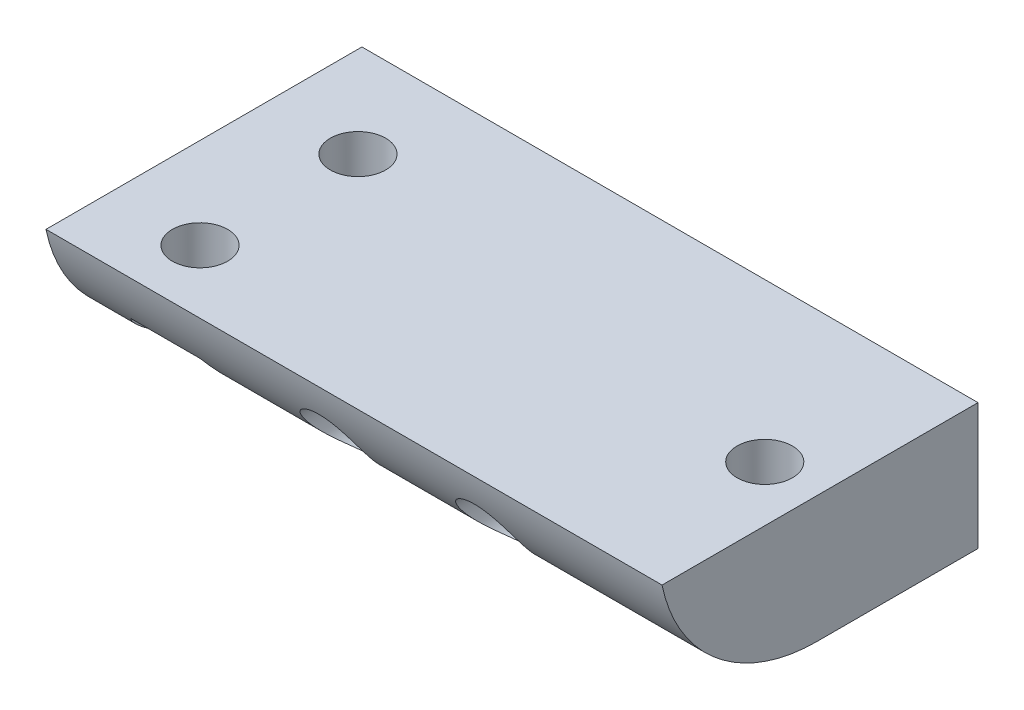
ISO-10303-21;
HEADER;
FILE_DESCRIPTION(('STEP AP214'),'2;1');
FILE_NAME('part.step','',(''),(''),'','','');
FILE_SCHEMA(('AUTOMOTIVE_DESIGN { 1 0 10303 214 1 1 1 1 }'));
ENDSEC;
DATA;
#1=APPLICATION_CONTEXT('core data for automotive mechanical design processes');
#2=APPLICATION_PROTOCOL_DEFINITION('international standard','automotive_design',2000,#1);
#3=PRODUCT_CONTEXT('',#1,'mechanical');
#4=PRODUCT('Part','Part','',(#3));
#5=PRODUCT_RELATED_PRODUCT_CATEGORY('part','',(#4));
#6=PRODUCT_DEFINITION_FORMATION('','',#4);
#7=PRODUCT_DEFINITION_CONTEXT('part definition',#1,'design');
#8=PRODUCT_DEFINITION('design','',#6,#7);
#9=PRODUCT_DEFINITION_SHAPE('','',#8);
#10=(LENGTH_UNIT() NAMED_UNIT(*) SI_UNIT(.MILLI.,.METRE.));
#11=(NAMED_UNIT(*) PLANE_ANGLE_UNIT() SI_UNIT($,.RADIAN.));
#12=(NAMED_UNIT(*) SI_UNIT($,.STERADIAN.) SOLID_ANGLE_UNIT());
#13=UNCERTAINTY_MEASURE_WITH_UNIT(LENGTH_MEASURE(1.E-05),#10,'distance_accuracy_value','');
#14=(GEOMETRIC_REPRESENTATION_CONTEXT(3) GLOBAL_UNCERTAINTY_ASSIGNED_CONTEXT((#13)) GLOBAL_UNIT_ASSIGNED_CONTEXT((#10,
#11,#12)) REPRESENTATION_CONTEXT('',''));
#15=CARTESIAN_POINT('',(0.,0.,0.));
#16=DIRECTION('',(0.,0.,1.));
#17=DIRECTION('',(1.,0.,0.));
#18=AXIS2_PLACEMENT_3D('',#15,#16,#17);
#19=CARTESIAN_POINT('',(-0.885282092778937,3.79686795239579,56.));
#20=DIRECTION('',(0.,1.,0.));
#21=DIRECTION('',(0.,0.,-1.));
#22=AXIS2_PLACEMENT_3D('',#19,#20,#21);
#23=CYLINDRICAL_SURFACE('',#22,1.75);
#24=CARTESIAN_POINT('',(-0.885282092778937,11.7978679523958,56.));
#25=DIRECTION('',(0.,-1.,0.));
#26=DIRECTION('',(0.,0.,-1.));
#27=AXIS2_PLACEMENT_3D('',#24,#25,#26);
#28=CIRCLE('',#27,1.75);
#29=CARTESIAN_POINT('',(-0.885282092778937,11.7978679523958,54.25));
#30=VERTEX_POINT('',#29);
#31=EDGE_CURVE('E216',#30,#30,#28,.T.);
#32=ORIENTED_EDGE('',*,*,#31,.F.);
#33=EDGE_LOOP('',(#32));
#34=FACE_BOUND('',#33,.T.);
#35=CARTESIAN_POINT('',(-0.885282092778937,7.79786795239579,56.));
#36=DIRECTION('',(0.,1.,0.));
#37=DIRECTION('',(0.,0.,1.));
#38=AXIS2_PLACEMENT_3D('',#35,#36,#37);
#39=CIRCLE('',#38,1.75);
#40=CARTESIAN_POINT('',(-0.885282092778937,7.79786795239579,57.75));
#41=VERTEX_POINT('',#40);
#42=EDGE_CURVE('E210',#41,#41,#39,.F.);
#43=ORIENTED_EDGE('',*,*,#42,.T.);
#44=EDGE_LOOP('',(#43));
#45=FACE_BOUND('',#44,.T.);
#46=ADVANCED_FACE('F39',(#34,#45),#23,.F.);
#47=CARTESIAN_POINT('',(-0.885282092778937,3.79686795239579,46.));
#48=DIRECTION('',(0.,1.,0.));
#49=DIRECTION('',(0.,0.,-1.));
#50=AXIS2_PLACEMENT_3D('',#47,#48,#49);
#51=CYLINDRICAL_SURFACE('',#50,1.75);
#52=CARTESIAN_POINT('',(-0.885282092778937,11.7978679523958,46.));
#53=DIRECTION('',(0.,-1.,0.));
#54=DIRECTION('',(0.,0.,-1.));
#55=AXIS2_PLACEMENT_3D('',#52,#53,#54);
#56=CIRCLE('',#55,1.75);
#57=CARTESIAN_POINT('',(-0.885282092778937,11.7978679523958,44.25));
#58=VERTEX_POINT('',#57);
#59=EDGE_CURVE('E231',#58,#58,#56,.T.);
#60=ORIENTED_EDGE('',*,*,#59,.F.);
#61=EDGE_LOOP('',(#60));
#62=FACE_BOUND('',#61,.T.);
#63=CARTESIAN_POINT('',(-0.885282092778937,7.79786795239579,46.));
#64=DIRECTION('',(0.,1.,0.));
#65=DIRECTION('',(0.,0.,1.));
#66=AXIS2_PLACEMENT_3D('',#63,#64,#65);
#67=CIRCLE('',#66,1.75);
#68=CARTESIAN_POINT('',(-0.885282092778937,7.79786795239579,47.75));
#69=VERTEX_POINT('',#68);
#70=EDGE_CURVE('E44',#69,#69,#67,.F.);
#71=ORIENTED_EDGE('',*,*,#70,.T.);
#72=EDGE_LOOP('',(#71));
#73=FACE_BOUND('',#72,.T.);
#74=ADVANCED_FACE('F175',(#62,#73),#51,.F.);
#75=CARTESIAN_POINT('',(28.8647179072211,3.79686795239579,50.));
#76=DIRECTION('',(0.,1.,0.));
#77=DIRECTION('',(0.,0.,-1.));
#78=AXIS2_PLACEMENT_3D('',#75,#76,#77);
#79=CYLINDRICAL_SURFACE('',#78,1.75);
#80=CARTESIAN_POINT('',(28.8647179072211,11.7978679523958,50.));
#81=DIRECTION('',(0.,-1.,0.));
#82=DIRECTION('',(0.,0.,-1.));
#83=AXIS2_PLACEMENT_3D('',#80,#81,#82);
#84=CIRCLE('',#83,1.75);
#85=CARTESIAN_POINT('',(28.8647179072211,11.7978679523958,48.25));
#86=VERTEX_POINT('',#85);
#87=EDGE_CURVE('E227',#86,#86,#84,.T.);
#88=ORIENTED_EDGE('',*,*,#87,.F.);
#89=EDGE_LOOP('',(#88));
#90=FACE_BOUND('',#89,.T.);
#91=CARTESIAN_POINT('',(28.8647179072211,7.79786795239579,50.));
#92=DIRECTION('',(0.,1.,0.));
#93=DIRECTION('',(0.,0.,1.));
#94=AXIS2_PLACEMENT_3D('',#91,#92,#93);
#95=CIRCLE('',#94,1.75);
#96=CARTESIAN_POINT('',(28.8647179072211,7.79786795239579,51.75));
#97=VERTEX_POINT('',#96);
#98=EDGE_CURVE('E207',#97,#97,#95,.F.);
#99=ORIENTED_EDGE('',*,*,#98,.T.);
#100=EDGE_LOOP('',(#99));
#101=FACE_BOUND('',#100,.T.);
#102=ADVANCED_FACE('F159',(#90,#101),#79,.F.);
#103=CARTESIAN_POINT('',(0.,0.,40.));
#104=DIRECTION('',(0.,0.,-1.));
#105=DIRECTION('',(1.,0.,0.));
#106=AXIS2_PLACEMENT_3D('',#103,#104,#105);
#107=PLANE('',#106);
#108=CARTESIAN_POINT('',(9.88971790722106,7.54786795239579,40.));
#109=DIRECTION('',(0.,0.,1.));
#110=DIRECTION('',(1.,0.,0.));
#111=AXIS2_PLACEMENT_3D('',#108,#109,#110);
#112=CIRCLE('',#111,2.);
#113=CARTESIAN_POINT('',(11.8897179072211,7.54786795239579,40.));
#114=VERTEX_POINT('',#113);
#115=EDGE_CURVE('E139',#114,#114,#112,.T.);
#116=ORIENTED_EDGE('',*,*,#115,.T.);
#117=EDGE_LOOP('',(#116));
#118=FACE_BOUND('',#117,.T.);
#119=DIRECTION('',(0.,-1.,0.));
#120=VECTOR('',#119,1.);
#121=CARTESIAN_POINT('',(-6.63528209277894,11.7978679523958,40.));
#122=LINE('',#121,#120);
#123=CARTESIAN_POINT('',(-6.63528209277894,11.7978679523958,40.));
#124=VERTEX_POINT('',#123);
#125=CARTESIAN_POINT('',(-6.63528209277894,3.79786795239579,40.));
#126=VERTEX_POINT('',#125);
#127=EDGE_CURVE('E245',#124,#126,#122,.T.);
#128=ORIENTED_EDGE('',*,*,#127,.F.);
#129=DIRECTION('',(-1.,0.,0.));
#130=VECTOR('',#129,1.);
#131=CARTESIAN_POINT('',(-6.63528209277894,11.7978679523958,40.));
#132=LINE('',#131,#130);
#133=CARTESIAN_POINT('',(32.3647179072211,11.7978679523958,40.));
#134=VERTEX_POINT('',#133);
#135=EDGE_CURVE('E256',#134,#124,#132,.T.);
#136=ORIENTED_EDGE('',*,*,#135,.F.);
#137=DIRECTION('',(0.,1.,0.));
#138=VECTOR('',#137,1.);
#139=CARTESIAN_POINT('',(32.3647179072211,11.7978679523958,40.));
#140=LINE('',#139,#138);
#141=CARTESIAN_POINT('',(32.3647179072211,3.79786795239579,40.));
#142=VERTEX_POINT('',#141);
#143=EDGE_CURVE('E252',#142,#134,#140,.T.);
#144=ORIENTED_EDGE('',*,*,#143,.F.);
#145=DIRECTION('',(1.,0.,0.));
#146=VECTOR('',#145,1.);
#147=CARTESIAN_POINT('',(-6.63528209277894,3.79786795239579,40.));
#148=LINE('',#147,#146);
#149=EDGE_CURVE('E249',#126,#142,#148,.T.);
#150=ORIENTED_EDGE('',*,*,#149,.F.);
#151=EDGE_LOOP('',(#128,#136,#144,#150));
#152=FACE_BOUND('',#151,.T.);
#153=CARTESIAN_POINT('',(19.7397179072211,7.54786795239579,40.));
#154=DIRECTION('',(0.,0.,1.));
#155=DIRECTION('',(1.,0.,0.));
#156=AXIS2_PLACEMENT_3D('',#153,#154,#155);
#157=CIRCLE('',#156,2.);
#158=CARTESIAN_POINT('',(21.7397179072211,7.54786795239579,40.));
#159=VERTEX_POINT('',#158);
#160=EDGE_CURVE('E140',#159,#159,#157,.T.);
#161=ORIENTED_EDGE('',*,*,#160,.T.);
#162=EDGE_LOOP('',(#161));
#163=FACE_BOUND('',#162,.T.);
#164=ADVANCED_FACE('F155',(#118,#152,#163),#107,.T.);
#165=CARTESIAN_POINT('',(-6.63528209277894,11.7978679523958,40.));
#166=DIRECTION('',(1.,0.,0.));
#167=DIRECTION('',(0.,1.,0.));
#168=AXIS2_PLACEMENT_3D('',#165,#166,#167);
#169=PLANE('',#168);
#170=DIRECTION('',(0.,0.,1.));
#171=VECTOR('',#170,1.);
#172=CARTESIAN_POINT('',(-6.63528209277894,11.7978679523958,40.));
#173=LINE('',#172,#171);
#174=CARTESIAN_POINT('',(-6.63528209277894,11.7978679523958,60.));
#175=VERTEX_POINT('',#174);
#176=EDGE_CURVE('E260',#124,#175,#173,.T.);
#177=ORIENTED_EDGE('',*,*,#176,.F.);
#178=ORIENTED_EDGE('',*,*,#127,.T.);
#179=DIRECTION('',(0.,0.,1.));
#180=VECTOR('',#179,1.);
#181=CARTESIAN_POINT('',(-6.63528209277894,3.79786795239579,40.));
#182=LINE('',#181,#180);
#183=CARTESIAN_POINT('',(-6.63528209277894,3.79786795239579,50.2020410288673));
#184=VERTEX_POINT('',#183);
#185=EDGE_CURVE('E117',#126,#184,#182,.T.);
#186=ORIENTED_EDGE('',*,*,#185,.T.);
#187=CARTESIAN_POINT('',(-6.63528209277894,13.7978679523958,50.2020410288673));
#188=DIRECTION('',(-1.,0.,0.));
#189=DIRECTION('',(0.,1.,0.));
#190=AXIS2_PLACEMENT_3D('',#187,#188,#189);
#191=CIRCLE('',#190,10.);
#192=EDGE_CURVE('E104',#175,#184,#191,.F.);
#193=ORIENTED_EDGE('',*,*,#192,.F.);
#194=EDGE_LOOP('',(#177,#178,#186,#193));
#195=FACE_BOUND('',#194,.T.);
#196=ADVANCED_FACE('F158',(#195),#169,.F.);
#197=CARTESIAN_POINT('',(-6.63528209277894,3.79786795239579,40.));
#198=DIRECTION('',(0.,1.,0.));
#199=DIRECTION('',(0.,0.,-1.));
#200=AXIS2_PLACEMENT_3D('',#197,#198,#199);
#201=PLANE('',#200);
#202=CARTESIAN_POINT('',(-0.885282092778937,3.79786795239579,46.));
#203=DIRECTION('',(0.,1.,0.));
#204=DIRECTION('',(0.,0.,1.));
#205=AXIS2_PLACEMENT_3D('',#202,#203,#204);
#206=CIRCLE('',#205,3.1);
#207=CARTESIAN_POINT('',(-0.885282092778937,3.79786795239579,49.1));
#208=VERTEX_POINT('',#207);
#209=EDGE_CURVE('E223',#208,#208,#206,.T.);
#210=ORIENTED_EDGE('',*,*,#209,.T.);
#211=EDGE_LOOP('',(#210));
#212=FACE_BOUND('',#211,.T.);
#213=DIRECTION('',(1.,0.,0.));
#214=VECTOR('',#213,1.);
#215=CARTESIAN_POINT('',(-6.63528209277894,3.79786795239579,50.2020410288673));
#216=LINE('',#215,#214);
#217=CARTESIAN_POINT('',(25.771308877905,3.79786795239579,50.2020410288673));
#218=VERTEX_POINT('',#217);
#219=EDGE_CURVE('E102',#184,#218,#216,.T.);
#220=ORIENTED_EDGE('',*,*,#219,.F.);
#221=ORIENTED_EDGE('',*,*,#185,.F.);
#222=ORIENTED_EDGE('',*,*,#149,.T.);
#223=DIRECTION('',(0.,0.,1.));
#224=VECTOR('',#223,1.);
#225=CARTESIAN_POINT('',(32.3647179072211,3.79786795239579,40.));
#226=LINE('',#225,#224);
#227=CARTESIAN_POINT('',(32.3647179072211,3.79786795239579,50.2020410288673));
#228=VERTEX_POINT('',#227);
#229=EDGE_CURVE('E115',#142,#228,#226,.T.);
#230=ORIENTED_EDGE('',*,*,#229,.T.);
#231=DIRECTION('',(1.,0.,0.));
#232=VECTOR('',#231,1.);
#233=CARTESIAN_POINT('',(-6.63528209277894,3.79786795239579,50.2020410288673));
#234=LINE('',#233,#232);
#235=CARTESIAN_POINT('',(31.9581269365371,3.79786795239579,50.2020410288673));
#236=VERTEX_POINT('',#235);
#237=EDGE_CURVE('E99',#236,#228,#234,.T.);
#238=ORIENTED_EDGE('',*,*,#237,.F.);
#239=CARTESIAN_POINT('',(28.8647179072211,3.79786795239579,50.));
#240=DIRECTION('',(0.,1.,0.));
#241=DIRECTION('',(0.,0.,1.));
#242=AXIS2_PLACEMENT_3D('',#239,#240,#241);
#243=CIRCLE('',#242,3.1);
#244=EDGE_CURVE('E106',#236,#218,#243,.T.);
#245=ORIENTED_EDGE('',*,*,#244,.T.);
#246=EDGE_LOOP('',(#220,#221,#222,#230,#238,#245));
#247=FACE_BOUND('',#246,.T.);
#248=ADVANCED_FACE('F113',(#212,#247),#201,.F.);
#249=CARTESIAN_POINT('',(32.3647179072211,11.7978679523958,40.));
#250=DIRECTION('',(-1.,0.,0.));
#251=DIRECTION('',(0.,0.,-1.));
#252=AXIS2_PLACEMENT_3D('',#249,#250,#251);
#253=PLANE('',#252);
#254=ORIENTED_EDGE('',*,*,#229,.F.);
#255=ORIENTED_EDGE('',*,*,#143,.T.);
#256=DIRECTION('',(0.,0.,1.));
#257=VECTOR('',#256,1.);
#258=CARTESIAN_POINT('',(32.3647179072211,11.7978679523958,40.));
#259=LINE('',#258,#257);
#260=CARTESIAN_POINT('',(32.3647179072211,11.7978679523958,60.));
#261=VERTEX_POINT('',#260);
#262=EDGE_CURVE('E266',#134,#261,#259,.T.);
#263=ORIENTED_EDGE('',*,*,#262,.T.);
#264=CARTESIAN_POINT('',(32.3647179072211,13.7978679523958,50.2020410288673));
#265=DIRECTION('',(1.,0.,0.));
#266=DIRECTION('',(0.,0.,-1.));
#267=AXIS2_PLACEMENT_3D('',#264,#265,#266);
#268=CIRCLE('',#267,10.);
#269=EDGE_CURVE('E121',#228,#261,#268,.F.);
#270=ORIENTED_EDGE('',*,*,#269,.F.);
#271=EDGE_LOOP('',(#254,#255,#263,#270));
#272=FACE_BOUND('',#271,.T.);
#273=ADVANCED_FACE('F163',(#272),#253,.F.);
#274=CARTESIAN_POINT('',(-6.63528209277894,11.7978679523958,40.));
#275=DIRECTION('',(0.,-1.,0.));
#276=DIRECTION('',(0.,0.,1.));
#277=AXIS2_PLACEMENT_3D('',#274,#275,#276);
#278=PLANE('',#277);
#279=ORIENTED_EDGE('',*,*,#87,.T.);
#280=EDGE_LOOP('',(#279));
#281=FACE_BOUND('',#280,.T.);
#282=ORIENTED_EDGE('',*,*,#59,.T.);
#283=EDGE_LOOP('',(#282));
#284=FACE_BOUND('',#283,.T.);
#285=ORIENTED_EDGE('',*,*,#31,.T.);
#286=EDGE_LOOP('',(#285));
#287=FACE_BOUND('',#286,.T.);
#288=DIRECTION('',(-1.,0.,0.));
#289=VECTOR('',#288,1.);
#290=CARTESIAN_POINT('',(-6.63528209277894,11.7978679523958,60.));
#291=LINE('',#290,#289);
#292=EDGE_CURVE('E244',#261,#175,#291,.T.);
#293=ORIENTED_EDGE('',*,*,#292,.F.);
#294=ORIENTED_EDGE('',*,*,#262,.F.);
#295=ORIENTED_EDGE('',*,*,#135,.T.);
#296=ORIENTED_EDGE('',*,*,#176,.T.);
#297=EDGE_LOOP('',(#293,#294,#295,#296));
#298=FACE_BOUND('',#297,.T.);
#299=ADVANCED_FACE('F151',(#281,#284,#287,#298),#278,.F.);
#300=CARTESIAN_POINT('',(9.88971790722106,7.54786795239579,40.));
#301=DIRECTION('',(0.,0.,1.));
#302=DIRECTION('',(-1.,0.,0.));
#303=AXIS2_PLACEMENT_3D('',#300,#301,#302);
#304=CYLINDRICAL_SURFACE('',#303,2.);
#305=ORIENTED_EDGE('',*,*,#115,.F.);
#306=EDGE_LOOP('',(#305));
#307=FACE_BOUND('',#306,.T.);
#308=CARTESIAN_POINT('',(8.06706713452882,8.37124159832121,58.601548539029));
#309=CARTESIAN_POINT('',(8.03684840403237,8.30434313191308,58.5583261607813));
#310=CARTESIAN_POINT('',(8.01070371922054,8.23664322015131,58.5134495620556));
#311=CARTESIAN_POINT('',(7.96628275027579,8.10061553952446,58.4208077045263));
#312=CARTESIAN_POINT('',(7.94801321392808,8.03228728325485,58.3730400083013));
#313=CARTESIAN_POINT('',(7.90437238311397,7.82711414357992,58.2256533635746));
#314=CARTESIAN_POINT('',(7.89034402169671,7.69048724323069,58.1222115097615));
#315=CARTESIAN_POINT('',(7.88906368612502,7.40811192355309,57.8966698866913));
#316=CARTESIAN_POINT('',(7.90494558743367,7.26302650368383,57.7737720041326));
#317=CARTESIAN_POINT('',(7.96568742907636,6.98343871907239,57.5231597558677));
#318=CARTESIAN_POINT('',(8.0105585403283,6.84894045648772,57.3954435513053));
#319=CARTESIAN_POINT('',(8.09804184445983,6.65626652154989,57.2024697015324));
#320=CARTESIAN_POINT('',(8.13085053201474,6.59316860126641,57.1374783292698));
#321=CARTESIAN_POINT('',(8.20315124999806,6.47057706504911,57.0078285547478));
#322=CARTESIAN_POINT('',(8.24264071200764,6.41108207586274,56.9431700343302));
#323=CARTESIAN_POINT('',(8.32828315761671,6.2960452169771,56.8149126824572));
#324=CARTESIAN_POINT('',(8.37442861469255,6.24049898658284,56.7513127433822));
#325=CARTESIAN_POINT('',(8.47360444702865,6.13367892559521,56.6259791055149));
#326=CARTESIAN_POINT('',(8.5266308510256,6.08240265844842,56.5642443553913));
#327=CARTESIAN_POINT('',(8.64902642423236,5.97680849475583,56.4341438331699));
#328=CARTESIAN_POINT('',(8.71965348019377,5.92330461898732,56.3662857431302));
#329=CARTESIAN_POINT('',(8.87165787449071,5.82398218637763,56.2372496307611));
#330=CARTESIAN_POINT('',(8.95302139950199,5.77815392332546,56.1760632064786));
#331=CARTESIAN_POINT('',(9.10605828855624,5.70635824440362,56.0782823441685));
#332=CARTESIAN_POINT('',(9.1752129500256,5.67827653517361,56.0393371864255));
#333=CARTESIAN_POINT('',(9.32019681286711,5.62915141059759,55.9703910759463));
#334=CARTESIAN_POINT('',(9.39601376439686,5.60809540567515,55.9403741350609));
#335=CARTESIAN_POINT('',(9.53701188650633,5.57818192620844,55.8974169125104));
#336=CARTESIAN_POINT('',(9.60115333173919,5.56770282164011,55.8822296106611));
#337=CARTESIAN_POINT('',(9.73162331195037,5.5530493587498,55.8609402087646));
#338=CARTESIAN_POINT('',(9.79794959120912,5.54886869398012,55.854829021151));
#339=CARTESIAN_POINT('',(9.9310185609371,5.5471855948123,55.8523723660674));
#340=CARTESIAN_POINT('',(9.99776184146238,5.54969760797718,55.8560480255694));
#341=CARTESIAN_POINT('',(10.129495552086,5.56118947051188,55.8727750518683));
#342=CARTESIAN_POINT('',(10.1944844417527,5.5701748236472,55.8858343968409));
#343=CARTESIAN_POINT('',(10.3365924075314,5.59678492783064,55.9241818911909));
#344=CARTESIAN_POINT('',(10.4128133687158,5.61598027784545,55.9516729786255));
#345=CARTESIAN_POINT('',(10.558870638318,5.66156962265168,56.0160073741236));
#346=CARTESIAN_POINT('',(10.6286933269441,5.68797851814815,56.0528700295859));
#347=CARTESIAN_POINT('',(10.796875764961,5.76197518714132,56.1543626775795));
#348=CARTESIAN_POINT('',(10.8908660112933,5.81338723672818,56.2233841046516));
#349=CARTESIAN_POINT('',(11.0649277912908,5.92623990535108,56.3701940537324));
#350=CARTESIAN_POINT('',(11.1449641295273,5.98770514625471,56.4480039515692));
#351=CARTESIAN_POINT('',(11.2742359123618,6.10266136958501,56.5887401851632));
#352=CARTESIAN_POINT('',(11.3262076065718,6.15440143610911,56.6506265374632));
#353=CARTESIAN_POINT('',(11.4233395343652,6.26207361634839,56.776129592004));
#354=CARTESIAN_POINT('',(11.4684965630168,6.31800768410363,56.8397470919043));
#355=CARTESIAN_POINT('',(11.5521820380131,6.43372625882879,56.9679018700757));
#356=CARTESIAN_POINT('',(11.5907070106654,6.49351276120705,57.0324396112983));
#357=CARTESIAN_POINT('',(11.661109769403,6.61663244317661,57.1617716001406));
#358=CARTESIAN_POINT('',(11.6929850519517,6.67996694720942,57.2265659350436));
#359=CARTESIAN_POINT('',(11.7796131969431,6.87757946250146,57.4231543876984));
#360=CARTESIAN_POINT('',(11.8236903165677,7.01714715268273,57.5545590247186));
#361=CARTESIAN_POINT('',(11.8806523094256,7.30715715388089,57.8117790010141));
#362=CARTESIAN_POINT('',(11.8935877802272,7.45758141540277,57.9376030803236));
#363=CARTESIAN_POINT('',(11.8849827321834,7.72885849223791,58.1512305087954));
#364=CARTESIAN_POINT('',(11.8708189939144,7.84836891350585,58.2410280440232));
#365=CARTESIAN_POINT('',(11.8192962610595,8.08795393541835,58.4129182421623));
#366=CARTESIAN_POINT('',(11.7819661239353,8.20802764999484,58.4950203447361));
#367=CARTESIAN_POINT('',(11.6902681564626,8.42512892739424,58.6369529948687));
#368=CARTESIAN_POINT('',(11.6396013579732,8.52275967673197,58.6982424719991));
#369=CARTESIAN_POINT('',(11.5201091781366,8.71160729000116,58.8126228526022));
#370=CARTESIAN_POINT('',(11.451288263743,8.80282572474656,58.8657157678118));
#371=CARTESIAN_POINT('',(11.2954996380895,8.97522672132363,58.9628631882565));
#372=CARTESIAN_POINT('',(11.2084218706267,9.05634343060684,59.0068595070477));
#373=CARTESIAN_POINT('',(11.0182555167431,9.20341028579624,59.0844901899622));
#374=CARTESIAN_POINT('',(10.9151755318249,9.2693685327005,59.1181300920501));
#375=CARTESIAN_POINT('',(10.7089068072316,9.37565936029879,59.17127760703));
#376=CARTESIAN_POINT('',(10.6070846536291,9.41806256008998,59.1919630785863));
#377=CARTESIAN_POINT('',(10.396581196682,9.48572544987975,59.2246158026805));
#378=CARTESIAN_POINT('',(10.2879031337039,9.5109931733865,59.2365871407994));
#379=CARTESIAN_POINT('',(10.0749956447425,9.54196774307373,59.251216811826));
#380=CARTESIAN_POINT('',(9.97098548825754,9.54891728229886,59.2544670817389));
#381=CARTESIAN_POINT('',(9.76319917015645,9.54656265622635,59.2533617852767));
#382=CARTESIAN_POINT('',(9.65942296807273,9.53726155912013,59.2490076546459));
#383=CARTESIAN_POINT('',(9.45712501358356,9.50316489374229,59.2328696412277));
#384=CARTESIAN_POINT('',(9.35854061593182,9.47867044646765,59.2212301098696));
#385=CARTESIAN_POINT('',(9.16722198191219,9.41552612890989,59.1907172664889));
#386=CARTESIAN_POINT('',(9.0744873559411,9.37687720250473,59.171844436808));
#387=CARTESIAN_POINT('',(8.89564975609166,9.28627249757092,59.1266195330204));
#388=CARTESIAN_POINT('',(8.80968911000281,9.23409826550997,59.1001438235197));
#389=CARTESIAN_POINT('',(8.64809221646538,9.11892492256977,59.0401233266356));
#390=CARTESIAN_POINT('',(8.57246120689919,9.05592035621934,59.006574974673));
#391=CARTESIAN_POINT('',(8.42876445055972,8.91758910333795,58.9306978114702));
#392=CARTESIAN_POINT('',(8.36139724817968,8.84175805283822,58.8879709994366));
#393=CARTESIAN_POINT('',(8.24049755832886,8.68363485707528,58.7958156867291));
#394=CARTESIAN_POINT('',(8.18694959305393,8.60135007603825,58.7463947790402));
#395=CARTESIAN_POINT('',(8.11365787760933,8.46908610848271,58.6641516995079));
#396=CARTESIAN_POINT('',(8.08926348362562,8.42038005285062,58.633296364984));
#397=CARTESIAN_POINT('',(8.06706713452882,8.37124159832121,58.601548539029));
#398=B_SPLINE_CURVE_WITH_KNOTS('',3,(#308,#309,#310,#311,#312,#313,#314,#315,#316,#317,#318,
#319,#320,#321,#322,#323,#324,#325,#326,#327,#328,#329,#330,#331,#332,#333,#334,#335,#336,#337,
#338,#339,#340,#341,#342,#343,#344,#345,#346,#347,#348,#349,#350,#351,#352,#353,#354,#355,#356,
#357,#358,#359,#360,#361,#362,#363,#364,#365,#366,#367,#368,#369,#370,#371,#372,#373,#374,#375,
#376,#377,#378,#379,#380,#381,#382,#383,#384,#385,#386,#387,#388,#389,#390,#391,#392,#393,#394,
#395,#396,#397),.UNSPECIFIED.,.T.,.F.,(4,2,2,2,2,2,2,2,2,2,2,2,2,2,2,2,2,2,2,2,2,2,2,2,2,2,2,2,
2,2,2,2,2,2,2,2,2,2,2,2,2,2,2,2,4),(0.,0.255491071982923,0.511200627260811,1.02413565654776,
1.59381515462571,2.163714308285,2.45250019619512,2.74117531183391,3.02952651946682,
3.31771204242053,3.65174783012232,3.98535796970025,4.23713480346648,4.48845801675372,
4.68784643525911,4.8870350788481,5.08665406152812,5.28644296493177,5.53486488228596,
5.78380388611113,6.16402622927968,6.545194139023,6.83271548200721,7.12037162744736,
7.40817798402832,7.69609250182189,8.28338586514439,8.86972437438287,9.31849455623655,
9.76670684190923,10.1429061897785,10.5190130572383,10.8974559531392,11.2756961285114,
11.6105842934499,11.9453153463191,12.2566727940372,12.5679714624558,12.8732893003509,
13.178586782123,13.4891611212393,13.7998923642037,14.1287473566934,14.457232411074,
14.6448964502869),.UNSPECIFIED.);
#399=CARTESIAN_POINT('',(8.06706713452882,8.37124159832121,58.601548539029));
#400=VERTEX_POINT('',#399);
#401=EDGE_CURVE('E131',#400,#400,#398,.T.);
#402=ORIENTED_EDGE('',*,*,#401,.T.);
#403=EDGE_LOOP('',(#402));
#404=FACE_BOUND('',#403,.T.);
#405=ADVANCED_FACE('F146',(#307,#404),#304,.F.);
#406=CARTESIAN_POINT('',(19.7397179072211,7.54786795239579,40.));
#407=DIRECTION('',(0.,0.,1.));
#408=DIRECTION('',(-1.,0.,0.));
#409=AXIS2_PLACEMENT_3D('',#406,#407,#408);
#410=CYLINDRICAL_SURFACE('',#409,2.);
#411=ORIENTED_EDGE('',*,*,#160,.F.);
#412=EDGE_LOOP('',(#411));
#413=FACE_BOUND('',#412,.T.);
#414=CARTESIAN_POINT('',(17.9170671345288,8.37124159832121,58.601548539029));
#415=CARTESIAN_POINT('',(17.8868484040324,8.30434313191308,58.5583261607813));
#416=CARTESIAN_POINT('',(17.8607037192205,8.23664322015132,58.5134495620556));
#417=CARTESIAN_POINT('',(17.8162827502758,8.10061553952446,58.4208077045263));
#418=CARTESIAN_POINT('',(17.7980132139281,8.03228728325485,58.3730400083013));
#419=CARTESIAN_POINT('',(17.754372383114,7.82711414357992,58.2256533635746));
#420=CARTESIAN_POINT('',(17.7403440216967,7.69048724323069,58.1222115097615));
#421=CARTESIAN_POINT('',(17.739063686125,7.40811192355309,57.8966698866913));
#422=CARTESIAN_POINT('',(17.7549455874337,7.26302650368383,57.7737720041326));
#423=CARTESIAN_POINT('',(17.8156874290764,6.98343871907239,57.5231597558677));
#424=CARTESIAN_POINT('',(17.8605585403283,6.84894045648772,57.3954435513053));
#425=CARTESIAN_POINT('',(17.9480418444598,6.65626652154989,57.2024697015324));
#426=CARTESIAN_POINT('',(17.9808505320147,6.59316860126641,57.1374783292698));
#427=CARTESIAN_POINT('',(18.0531512499981,6.47057706504911,57.0078285547478));
#428=CARTESIAN_POINT('',(18.0926407120076,6.41108207586274,56.9431700343302));
#429=CARTESIAN_POINT('',(18.1782831576167,6.2960452169771,56.8149126824572));
#430=CARTESIAN_POINT('',(18.2244286146926,6.24049898658284,56.7513127433822));
#431=CARTESIAN_POINT('',(18.3236044470286,6.13367892559521,56.6259791055149));
#432=CARTESIAN_POINT('',(18.3766308510256,6.08240265844842,56.5642443553913));
#433=CARTESIAN_POINT('',(18.4990264242324,5.97680849475583,56.4341438331699));
#434=CARTESIAN_POINT('',(18.5696534801938,5.92330461898732,56.3662857431302));
#435=CARTESIAN_POINT('',(18.7216578744907,5.82398218637763,56.2372496307611));
#436=CARTESIAN_POINT('',(18.803021399502,5.77815392332546,56.1760632064786));
#437=CARTESIAN_POINT('',(18.9560582885562,5.70635824440362,56.0782823441685));
#438=CARTESIAN_POINT('',(19.0252129500256,5.67827653517361,56.0393371864255));
#439=CARTESIAN_POINT('',(19.1701968128671,5.62915141059759,55.9703910759463));
#440=CARTESIAN_POINT('',(19.2460137643968,5.60809540567515,55.9403741350609));
#441=CARTESIAN_POINT('',(19.3870118865063,5.57818192620844,55.8974169125104));
#442=CARTESIAN_POINT('',(19.4511533317392,5.56770282164011,55.8822296106611));
#443=CARTESIAN_POINT('',(19.5816233119504,5.5530493587498,55.8609402087646));
#444=CARTESIAN_POINT('',(19.6479495912091,5.54886869398012,55.854829021151));
#445=CARTESIAN_POINT('',(19.7810185609371,5.5471855948123,55.8523723660674));
#446=CARTESIAN_POINT('',(19.8477618414624,5.54969760797718,55.8560480255694));
#447=CARTESIAN_POINT('',(19.979495552086,5.56118947051188,55.8727750518683));
#448=CARTESIAN_POINT('',(20.0444844417527,5.5701748236472,55.8858343968409));
#449=CARTESIAN_POINT('',(20.1865924075314,5.59678492783063,55.9241818911909));
#450=CARTESIAN_POINT('',(20.2628133687158,5.61598027784545,55.9516729786255));
#451=CARTESIAN_POINT('',(20.408870638318,5.66156962265168,56.0160073741236));
#452=CARTESIAN_POINT('',(20.4786933269441,5.68797851814815,56.0528700295859));
#453=CARTESIAN_POINT('',(20.6468757649609,5.76197518714132,56.1543626775795));
#454=CARTESIAN_POINT('',(20.7408660112933,5.81338723672817,56.2233841046516));
#455=CARTESIAN_POINT('',(20.9149277912907,5.92623990535108,56.3701940537324));
#456=CARTESIAN_POINT('',(20.9949641295273,5.9877051462547,56.4480039515692));
#457=CARTESIAN_POINT('',(21.1242359123618,6.102661369585,56.5887401851632));
#458=CARTESIAN_POINT('',(21.1762076065718,6.1544014361091,56.6506265374632));
#459=CARTESIAN_POINT('',(21.2733395343652,6.26207361634838,56.776129592004));
#460=CARTESIAN_POINT('',(21.3184965630168,6.31800768410362,56.8397470919043));
#461=CARTESIAN_POINT('',(21.4021820380131,6.43372625882878,56.9679018700757));
#462=CARTESIAN_POINT('',(21.4407070106654,6.49351276120704,57.0324396112983));
#463=CARTESIAN_POINT('',(21.511109769403,6.6166324431766,57.1617716001406));
#464=CARTESIAN_POINT('',(21.5429850519517,6.67996694720942,57.2265659350436));
#465=CARTESIAN_POINT('',(21.6296131969431,6.87757946250145,57.4231543876984));
#466=CARTESIAN_POINT('',(21.6736903165677,7.01714715268272,57.5545590247186));
#467=CARTESIAN_POINT('',(21.7306523094256,7.30715715388088,57.8117790010141));
#468=CARTESIAN_POINT('',(21.7435877802272,7.45758141540277,57.9376030803236));
#469=CARTESIAN_POINT('',(21.7349827321834,7.7288584922379,58.1512305087954));
#470=CARTESIAN_POINT('',(21.7208189939144,7.84836891350584,58.2410280440232));
#471=CARTESIAN_POINT('',(21.6692962610595,8.08795393541834,58.4129182421623));
#472=CARTESIAN_POINT('',(21.6319661239353,8.20802764999483,58.4950203447361));
#473=CARTESIAN_POINT('',(21.5402681564626,8.42512892739423,58.6369529948687));
#474=CARTESIAN_POINT('',(21.4896013579732,8.52275967673196,58.6982424719991));
#475=CARTESIAN_POINT('',(21.3701091781366,8.71160729000115,58.8126228526022));
#476=CARTESIAN_POINT('',(21.301288263743,8.80282572474656,58.8657157678118));
#477=CARTESIAN_POINT('',(21.1454996380895,8.97522672132362,58.9628631882565));
#478=CARTESIAN_POINT('',(21.0584218706267,9.05634343060684,59.0068595070477));
#479=CARTESIAN_POINT('',(20.8682555167431,9.20341028579623,59.0844901899622));
#480=CARTESIAN_POINT('',(20.7651755318249,9.26936853270049,59.1181300920501));
#481=CARTESIAN_POINT('',(20.5589068072317,9.37565936029879,59.17127760703));
#482=CARTESIAN_POINT('',(20.4570846536291,9.41806256008998,59.1919630785863));
#483=CARTESIAN_POINT('',(20.246581196682,9.48572544987975,59.2246158026805));
#484=CARTESIAN_POINT('',(20.1379031337039,9.5109931733865,59.2365871407994));
#485=CARTESIAN_POINT('',(19.9249956447425,9.54196774307373,59.251216811826));
#486=CARTESIAN_POINT('',(19.8209854882575,9.54891728229886,59.2544670817389));
#487=CARTESIAN_POINT('',(19.6131991701565,9.54656265622635,59.2533617852767));
#488=CARTESIAN_POINT('',(19.5094229680727,9.53726155912013,59.2490076546459));
#489=CARTESIAN_POINT('',(19.3071250135836,9.50316489374229,59.2328696412277));
#490=CARTESIAN_POINT('',(19.2085406159318,9.47867044646765,59.2212301098696));
#491=CARTESIAN_POINT('',(19.0172219819122,9.4155261289099,59.1907172664889));
#492=CARTESIAN_POINT('',(18.9244873559411,9.37687720250474,59.171844436808));
#493=CARTESIAN_POINT('',(18.7456497560917,9.28627249757093,59.1266195330204));
#494=CARTESIAN_POINT('',(18.6596891100028,9.23409826550997,59.1001438235197));
#495=CARTESIAN_POINT('',(18.4980922164654,9.11892492256978,59.0401233266356));
#496=CARTESIAN_POINT('',(18.4224612068992,9.05592035621934,59.006574974673));
#497=CARTESIAN_POINT('',(18.2787644505597,8.91758910333795,58.9306978114702));
#498=CARTESIAN_POINT('',(18.2113972481797,8.84175805283823,58.8879709994366));
#499=CARTESIAN_POINT('',(18.0904975583289,8.68363485707529,58.7958156867292));
#500=CARTESIAN_POINT('',(18.0369495930539,8.60135007603826,58.7463947790402));
#501=CARTESIAN_POINT('',(17.9636578776093,8.46908610848271,58.6641516995079));
#502=CARTESIAN_POINT('',(17.9392634836256,8.42038005285062,58.633296364984));
#503=CARTESIAN_POINT('',(17.9170671345288,8.37124159832121,58.601548539029));
#504=B_SPLINE_CURVE_WITH_KNOTS('',3,(#414,#415,#416,#417,#418,#419,#420,#421,#422,#423,#424,
#425,#426,#427,#428,#429,#430,#431,#432,#433,#434,#435,#436,#437,#438,#439,#440,#441,#442,#443,
#444,#445,#446,#447,#448,#449,#450,#451,#452,#453,#454,#455,#456,#457,#458,#459,#460,#461,#462,
#463,#464,#465,#466,#467,#468,#469,#470,#471,#472,#473,#474,#475,#476,#477,#478,#479,#480,#481,
#482,#483,#484,#485,#486,#487,#488,#489,#490,#491,#492,#493,#494,#495,#496,#497,#498,#499,#500,
#501,#502,#503),.UNSPECIFIED.,.T.,.F.,(4,2,2,2,2,2,2,2,2,2,2,2,2,2,2,2,2,2,2,2,2,2,2,2,2,2,2,2,
2,2,2,2,2,2,2,2,2,2,2,2,2,2,2,2,4),(0.,0.255491071982922,0.511200627260811,1.02413565654776,
1.59381515462571,2.163714308285,2.45250019619512,2.74117531183391,3.02952651946683,
3.31771204242053,3.65174783012232,3.98535796970024,4.23713480346648,4.48845801675371,
4.68784643525911,4.8870350788481,5.08665406152812,5.28644296493177,5.53486488228596,
5.78380388611113,6.16402622927968,6.54519413902299,6.8327154820072,7.12037162744735,
7.40817798402831,7.69609250182188,8.28338586514438,8.86972437438287,9.31849455623654,
9.76670684190924,10.1429061897785,10.5190130572383,10.8974559531392,11.2756961285114,
11.6105842934499,11.9453153463191,12.2566727940372,12.5679714624558,12.8732893003509,
13.178586782123,13.4891611212393,13.7998923642037,14.1287473566934,14.457232411074,
14.6448964502869),.UNSPECIFIED.);
#505=CARTESIAN_POINT('',(17.9170671345288,8.37124159832121,58.601548539029));
#506=VERTEX_POINT('',#505);
#507=EDGE_CURVE('E141',#506,#506,#504,.T.);
#508=ORIENTED_EDGE('',*,*,#507,.T.);
#509=EDGE_LOOP('',(#508));
#510=FACE_BOUND('',#509,.T.);
#511=ADVANCED_FACE('F150',(#413,#510),#410,.F.);
#512=CARTESIAN_POINT('',(0.,13.7978679523958,50.2020410288673));
#513=DIRECTION('',(1.,0.,0.));
#514=DIRECTION('',(0.,0.,1.));
#515=AXIS2_PLACEMENT_3D('',#512,#513,#514);
#516=CYLINDRICAL_SURFACE('',#515,10.);
#517=CARTESIAN_POINT('',(1.29669300038439,7.79786795239579,58.2020410288673));
#518=CARTESIAN_POINT('',(1.33876033623396,7.7422779014315,58.1603500195347));
#519=CARTESIAN_POINT('',(1.37949742757104,7.68648996608459,58.1176020759223));
#520=CARTESIAN_POINT('',(1.45833155705255,7.57469438065993,58.030013189573));
#521=CARTESIAN_POINT('',(1.49642865224825,7.51868673535784,57.9851722921005));
#522=CARTESIAN_POINT('',(1.60685672992809,7.35049797723885,57.847459518204));
#523=CARTESIAN_POINT('',(1.6752519717042,7.23824758648692,57.7514695790458));
#524=CARTESIAN_POINT('',(1.80172181500999,7.01389804381691,57.55055193651));
#525=CARTESIAN_POINT('',(1.85970321071213,6.90180838437658,57.4455548549031));
#526=CARTESIAN_POINT('',(1.9638176077174,6.67996566218069,57.2276853066029));
#527=CARTESIAN_POINT('',(2.00995643563,6.57021147483134,57.1148167476171));
#528=CARTESIAN_POINT('',(2.11035683197841,6.29670478100169,56.8195568805832));
#529=CARTESIAN_POINT('',(2.15599090580166,6.13512056524672,56.6319890969206));
#530=CARTESIAN_POINT('',(2.19757966074825,5.90222160133279,56.3399810129479));
#531=CARTESIAN_POINT('',(2.20697057627921,5.82625886789311,56.2410016599864));
#532=CARTESIAN_POINT('',(2.21609418752647,5.67790022956858,56.0399973314842));
#533=CARTESIAN_POINT('',(2.21582869627677,5.60550365767681,55.9379729312591));
#534=CARTESIAN_POINT('',(2.20133725979808,5.42073934325587,55.6669056626756));
#535=CARTESIAN_POINT('',(2.17848206310148,5.3116980072925,55.4958636445303));
#536=CARTESIAN_POINT('',(2.12105080421357,5.15824407529395,55.2386063362194));
#537=CARTESIAN_POINT('',(2.0980288410308,5.10875160980362,55.1526880239514));
#538=CARTESIAN_POINT('',(2.04396507944125,5.01337173314138,54.9813921876798));
#539=CARTESIAN_POINT('',(2.01292729671886,4.96748253181045,54.8960144147609));
#540=CARTESIAN_POINT('',(1.94236269805967,4.87920080956017,54.7260464753879));
#541=CARTESIAN_POINT('',(1.90277403023245,4.83683705851306,54.641467000449));
#542=CARTESIAN_POINT('',(1.81520078666388,4.75617947223526,54.4747959062278));
#543=CARTESIAN_POINT('',(1.76722024192775,4.71788369710013,54.3927031145882));
#544=CARTESIAN_POINT('',(1.66295594398472,4.64544734755363,54.2320488072887));
#545=CARTESIAN_POINT('',(1.60667375208367,4.61130599401131,54.1534866312364));
#546=CARTESIAN_POINT('',(1.48607194668386,4.54719257671595,54.000968287762));
#547=CARTESIAN_POINT('',(1.42175341566229,4.51721995259106,53.9270115020105));
#548=CARTESIAN_POINT('',(1.29385965233381,4.46479734275268,53.7934607465241));
#549=CARTESIAN_POINT('',(1.23115476867508,4.44187565759167,53.7332162044771));
#550=CARTESIAN_POINT('',(1.10027601092077,4.39910130274096,53.6177368709757));
#551=CARTESIAN_POINT('',(1.03210035814503,4.37924963738017,53.5625037213844));
#552=CARTESIAN_POINT('',(0.890824764345482,4.34251946331332,53.4577235187444));
#553=CARTESIAN_POINT('',(0.817728050730203,4.32563903172631,53.4081727955138));
#554=CARTESIAN_POINT('',(0.667130510635087,4.29469491026504,53.3152541926005));
#555=CARTESIAN_POINT('',(0.589628103741936,4.2806322394699,53.2718885514599));
#556=CARTESIAN_POINT('',(0.360718440720315,4.24394712770649,53.1565113713806));
#557=CARTESIAN_POINT('',(0.204380384871549,4.22470490330488,53.0929405924803));
#558=CARTESIAN_POINT('',(-0.11719392098203,4.19477881277458,52.9919294413791));
#559=CARTESIAN_POINT('',(-0.282429373629137,4.18409418109816,52.9544867318441));
#560=CARTESIAN_POINT('',(-0.615702709505659,4.17068206179112,52.9072020575791));
#561=CARTESIAN_POINT('',(-0.783704997630278,4.16788793759848,52.8971289796401));
#562=CARTESIAN_POINT('',(-1.11907863256369,4.169892438603,52.90428101791));
#563=CARTESIAN_POINT('',(-1.2864499787178,4.17469107167646,52.9215061624366));
#564=CARTESIAN_POINT('',(-1.61591763313632,4.19218833583503,52.9826738755485));
#565=CARTESIAN_POINT('',(-1.77801073474902,4.20489167833853,53.0266323775759));
#566=CARTESIAN_POINT('',(-2.09219603839721,4.23891752071122,53.1397151640686));
#567=CARTESIAN_POINT('',(-2.24428881076164,4.26023952855259,53.2088380119133));
#568=CARTESIAN_POINT('',(-2.53410833203265,4.31243456985766,53.3696362878839));
#569=CARTESIAN_POINT('',(-2.67184448610755,4.34330129722414,53.461296817431));
#570=CARTESIAN_POINT('',(-2.9293777846615,4.41550651819482,53.6636587074762));
#571=CARTESIAN_POINT('',(-3.04917634916112,4.45684418217429,53.7743585592432));
#572=CARTESIAN_POINT('',(-3.26900696673802,4.55100101490165,54.0114793531282));
#573=CARTESIAN_POINT('',(-3.36886487785487,4.60391353826339,54.1380243187944));
#574=CARTESIAN_POINT('',(-3.54594377665034,4.72110961217307,54.4012317065031));
#575=CARTESIAN_POINT('',(-3.62316074401539,4.78539517896739,54.5378959200133));
#576=CARTESIAN_POINT('',(-3.75785044072793,4.92825486371309,54.8233654039277));
#577=CARTESIAN_POINT('',(-3.81417263961338,5.00737408736577,54.9724375614188));
#578=CARTESIAN_POINT('',(-3.90252211747201,5.17641223147628,55.2715637866922));
#579=CARTESIAN_POINT('',(-3.93454285730764,5.26633405120738,55.4216181078112));
#580=CARTESIAN_POINT('',(-3.97870353678434,5.46705421973842,55.7370765585349));
#581=CARTESIAN_POINT('',(-3.98792953592242,5.57906063556046,55.9021108069117));
#582=CARTESIAN_POINT('',(-3.98133366411636,5.81256943418542,56.224895554675));
#583=CARTESIAN_POINT('',(-3.96548492544055,5.93408187009514,56.3826380544568));
#584=CARTESIAN_POINT('',(-3.91874580387918,6.15221314715562,56.649181442715));
#585=CARTESIAN_POINT('',(-3.892735922579,6.24725551445262,56.7601856755335));
#586=CARTESIAN_POINT('',(-3.82969996333189,6.4404880249161,56.9762541491083));
#587=CARTESIAN_POINT('',(-3.79266872424925,6.53867962355636,57.0813155794486));
#588=CARTESIAN_POINT('',(-3.70850798120996,6.73740846589345,57.2851332716707));
#589=CARTESIAN_POINT('',(-3.66136973648735,6.83794767236132,57.3838839793302));
#590=CARTESIAN_POINT('',(-3.55774341813391,7.04042672974237,57.5747160507079));
#591=CARTESIAN_POINT('',(-3.50125909688967,7.14236600353635,57.6668000698126));
#592=CARTESIAN_POINT('',(-3.38523270853055,7.33702660833272,57.8356828992006));
#593=CARTESIAN_POINT('',(-3.32650142932937,7.42969585515594,57.9131010096032));
#594=CARTESIAN_POINT('',(-3.20209207213561,7.61436973888586,58.0619659924939));
#595=CARTESIAN_POINT('',(-3.1364434329964,7.70637554331023,58.1334360238942));
#596=CARTESIAN_POINT('',(-3.06725718594226,7.79786795239579,58.2020410288673));
#597=B_SPLINE_CURVE_WITH_KNOTS('',3,(#517,#518,#519,#520,#521,#522,#523,#524,#525,#526,#527,
#528,#529,#530,#531,#532,#533,#534,#535,#536,#537,#538,#539,#540,#541,#542,#543,#544,#545,#546,
#547,#548,#549,#550,#551,#552,#553,#554,#555,#556,#557,#558,#559,#560,#561,#562,#563,#564,#565,
#566,#567,#568,#569,#570,#571,#572,#573,#574,#575,#576,#577,#578,#579,#580,#581,#582,#583,#584,
#585,#586,#587,#588,#589,#590,#591,#592,#593,#594,#595,#596),.UNSPECIFIED.,.F.,.F.,(4,2,2,2,2,2,
2,2,2,2,2,2,2,2,2,2,2,2,2,2,2,2,2,2,2,2,2,2,2,2,2,2,2,2,2,2,2,2,2,4),(0.,0.24364628232873,
0.487287297730533,0.974989828751799,1.46686070917264,1.95848912047045,2.71034462117831,
3.085318938263,3.46022285258844,4.06965285133877,4.37472284565768,4.67964030455134,
4.98684198488239,5.29389650533456,5.60089335094483,5.90784888924492,6.17727967742186,
6.44679842180845,6.71614209638323,6.98558300740463,7.49250893402908,7.99938950685363,
8.50197640509998,9.00456382470194,9.50745108716592,10.0103096445373,10.5128366757743,
11.0153239036456,11.5220239547398,12.0288139252808,12.5603932632425,13.0921155901144,
13.6889361426105,14.2863966251268,14.7311349097207,15.1760817871163,15.6214150279422,
16.0665699024103,16.4690961619392,16.869973705439),.UNSPECIFIED.);
#598=CARTESIAN_POINT('',(1.29669300038439,7.79786795239579,58.2020410288673));
#599=VERTEX_POINT('',#598);
#600=CARTESIAN_POINT('',(-3.06725718594226,7.79786795239579,58.2020410288673));
#601=VERTEX_POINT('',#600);
#602=EDGE_CURVE('E11',#599,#601,#597,.T.);
#603=ORIENTED_EDGE('',*,*,#602,.T.);
#604=DIRECTION('',(1.,0.,0.));
#605=VECTOR('',#604,1.);
#606=CARTESIAN_POINT('',(0.,7.79786795239579,58.2020410288673));
#607=LINE('',#606,#605);
#608=EDGE_CURVE('E50',#599,#601,#607,.F.);
#609=ORIENTED_EDGE('',*,*,#608,.F.);
#610=EDGE_LOOP('',(#603,#609));
#611=FACE_BOUND('',#610,.T.);
#612=CARTESIAN_POINT('',(25.771308877905,3.79786795239579,50.2020410288673));
#613=CARTESIAN_POINT('',(25.77685629068,3.79785794441976,50.2871368696566));
#614=CARTESIAN_POINT('',(25.7859351750501,3.7989539218189,50.3719946756401));
#615=CARTESIAN_POINT('',(25.8110328300862,3.80324778740322,50.5406052233695));
#616=CARTESIAN_POINT('',(25.8270500455566,3.80644520464313,50.6243582084237));
#617=CARTESIAN_POINT('',(25.8658572530667,3.81482191489134,50.7899697282263));
#618=CARTESIAN_POINT('',(25.8886308904753,3.81999643073312,50.8718323289177));
#619=CARTESIAN_POINT('',(25.9407571647545,3.83214598735977,51.0332756574066));
#620=CARTESIAN_POINT('',(25.9701099825051,3.83912107764825,51.1128563223995));
#621=CARTESIAN_POINT('',(26.067689370037,3.86242924103073,51.3472983518377));
#622=CARTESIAN_POINT('',(26.1454860770249,3.88115659878454,51.4980681350627));
#623=CARTESIAN_POINT('',(26.3242184648495,3.92280471964238,51.784495953027));
#624=CARTESIAN_POINT('',(26.425164078275,3.94572728194372,51.9201474636773));
#625=CARTESIAN_POINT('',(26.6505494171769,3.99384822723239,52.1765448459411));
#626=CARTESIAN_POINT('',(26.7755468466368,4.01909117101176,52.2967931229997));
#627=CARTESIAN_POINT('',(27.0439744175289,4.06836951224036,52.5149184449731));
#628=CARTESIAN_POINT('',(27.1874074976263,4.09240471632297,52.6127919163905));
#629=CARTESIAN_POINT('',(27.491600804679,4.13676131611397,52.784883487535));
#630=CARTESIAN_POINT('',(27.6526086084744,4.15701462941247,52.8586830708746));
#631=CARTESIAN_POINT('',(27.9854619034146,4.19067001431112,52.9779419113717));
#632=CARTESIAN_POINT('',(28.1573040162562,4.20407420981756,53.0234099550795));
#633=CARTESIAN_POINT('',(28.5011369413981,4.22191957711248,53.0833896591458));
#634=CARTESIAN_POINT('',(28.6729503897358,4.22663138333067,53.0988368645348));
#635=CARTESIAN_POINT('',(29.0167613978297,4.22729660387555,53.101035876481));
#636=CARTESIAN_POINT('',(29.1887589233347,4.22325143386487,53.0877923212187));
#637=CARTESIAN_POINT('',(29.5230827196112,4.20717369403985,53.0338823261755));
#638=CARTESIAN_POINT('',(29.685544904463,4.19536506153521,52.9939842304249));
#639=CARTESIAN_POINT('',(30.0014449040963,4.16542744220301,52.888870719654));
#640=CARTESIAN_POINT('',(30.1548810676841,4.14729730311414,52.8236506887967));
#641=CARTESIAN_POINT('',(30.4522363659656,4.10636099605372,52.6680669718147));
#642=CARTESIAN_POINT('',(30.5958614814771,4.08345827753882,52.5771675885786));
#643=CARTESIAN_POINT('',(30.8662001301919,4.03588078591664,52.3733379067919));
#644=CARTESIAN_POINT('',(30.9929109650784,4.0112057310339,52.2604041001706));
#645=CARTESIAN_POINT('',(31.2305502569055,3.96197037162313,52.0108689698048));
#646=CARTESIAN_POINT('',(31.3407445984829,3.93744630862083,51.873560897829));
#647=CARTESIAN_POINT('',(31.5365855726348,3.89241006859719,51.5817514933599));
#648=CARTESIAN_POINT('',(31.6222381374226,3.8718969224425,51.4272543283532));
#649=CARTESIAN_POINT('',(31.7315913281208,3.84573921982999,51.1829774696597));
#650=CARTESIAN_POINT('',(31.7652796489993,3.83768751087869,51.0977908058529));
#651=CARTESIAN_POINT('',(31.8250399324102,3.8236285307186,50.9245942885492));
#652=CARTESIAN_POINT('',(31.8511118720547,3.81762126565353,50.8365844265693));
#653=CARTESIAN_POINT('',(31.8954312392724,3.80787829590775,50.6582131644239));
#654=CARTESIAN_POINT('',(31.9136547832633,3.80414951068743,50.5678454617032));
#655=CARTESIAN_POINT('',(31.9420065028815,3.79913719049267,50.385759006891));
#656=CARTESIAN_POINT('',(31.9521325608382,3.79785429505081,50.2940399077625));
#657=CARTESIAN_POINT('',(31.9581269365371,3.79786795239579,50.2020410288673));
#658=B_SPLINE_CURVE_WITH_KNOTS('',3,(#612,#613,#614,#615,#616,#617,#618,#619,#620,#621,#622,
#623,#624,#625,#626,#627,#628,#629,#630,#631,#632,#633,#634,#635,#636,#637,#638,#639,#640,#641,
#642,#643,#644,#645,#646,#647,#648,#649,#650,#651,#652,#653,#654,#655,#656,#657),.UNSPECIFIED.,
.F.,.F.,(4,2,2,2,2,2,2,2,2,2,2,2,2,2,2,2,2,2,2,2,2,2,4),(0.,0.25573701047874,0.511416728295017,
0.766482527064836,1.02155533916657,1.5310657863657,2.04079526154658,2.56420141427911,
3.0876911023034,3.61984867480709,4.15184112534395,4.66697096792695,5.18201754025847,
5.68282350882354,6.18372081024794,6.69595559513904,7.20827199887787,7.73906741901353,
8.26973442737069,8.54529287756782,8.82085215583258,9.09724416750828,9.37370843814943),.UNSPECIFIED.);
#659=EDGE_CURVE('E64',#218,#236,#658,.T.);
#660=ORIENTED_EDGE('',*,*,#659,.T.);
#661=ORIENTED_EDGE('',*,*,#237,.T.);
#662=ORIENTED_EDGE('',*,*,#269,.T.);
#663=ORIENTED_EDGE('',*,*,#292,.T.);
#664=ORIENTED_EDGE('',*,*,#192,.T.);
#665=ORIENTED_EDGE('',*,*,#219,.T.);
#666=EDGE_LOOP('',(#660,#661,#662,#663,#664,#665));
#667=FACE_BOUND('',#666,.T.);
#668=ORIENTED_EDGE('',*,*,#401,.F.);
#669=EDGE_LOOP('',(#668));
#670=FACE_BOUND('',#669,.T.);
#671=ORIENTED_EDGE('',*,*,#507,.F.);
#672=EDGE_LOOP('',(#671));
#673=FACE_BOUND('',#672,.T.);
#674=ADVANCED_FACE('F41',(#611,#667,#670,#673),#516,.T.);
#675=CARTESIAN_POINT('',(28.8647179072211,7.79786795239579,50.));
#676=DIRECTION('',(0.,-1.,0.));
#677=DIRECTION('',(0.,0.,1.));
#678=AXIS2_PLACEMENT_3D('',#675,#676,#677);
#679=PLANE('',#678);
#680=CARTESIAN_POINT('',(28.8647179072211,7.79786795239579,50.));
#681=DIRECTION('',(0.,1.,0.));
#682=DIRECTION('',(0.,0.,1.));
#683=AXIS2_PLACEMENT_3D('',#680,#681,#682);
#684=CIRCLE('',#683,3.1);
#685=CARTESIAN_POINT('',(28.8647179072211,7.79786795239579,53.1));
#686=VERTEX_POINT('',#685);
#687=EDGE_CURVE('E111',#686,#686,#684,.T.);
#688=ORIENTED_EDGE('',*,*,#687,.F.);
#689=EDGE_LOOP('',(#688));
#690=FACE_BOUND('',#689,.T.);
#691=ORIENTED_EDGE('',*,*,#98,.F.);
#692=EDGE_LOOP('',(#691));
#693=FACE_BOUND('',#692,.T.);
#694=ADVANCED_FACE('F276',(#690,#693),#679,.T.);
#695=CARTESIAN_POINT('',(28.8647179072211,7.79786795239579,50.));
#696=DIRECTION('',(0.,-1.,0.));
#697=DIRECTION('',(0.,0.,1.));
#698=AXIS2_PLACEMENT_3D('',#695,#696,#697);
#699=CYLINDRICAL_SURFACE('',#698,3.1);
#700=ORIENTED_EDGE('',*,*,#659,.F.);
#701=ORIENTED_EDGE('',*,*,#244,.F.);
#702=EDGE_LOOP('',(#700,#701));
#703=FACE_BOUND('',#702,.T.);
#704=ORIENTED_EDGE('',*,*,#687,.T.);
#705=EDGE_LOOP('',(#704));
#706=FACE_BOUND('',#705,.T.);
#707=ADVANCED_FACE('F107',(#703,#706),#699,.F.);
#708=CARTESIAN_POINT('',(-0.885282092778937,7.79786795239579,56.));
#709=DIRECTION('',(0.,-1.,0.));
#710=DIRECTION('',(0.,0.,1.));
#711=AXIS2_PLACEMENT_3D('',#708,#709,#710);
#712=PLANE('',#711);
#713=CARTESIAN_POINT('',(-0.885282092778937,7.79786795239579,56.));
#714=DIRECTION('',(0.,1.,0.));
#715=DIRECTION('',(0.,0.,1.));
#716=AXIS2_PLACEMENT_3D('',#713,#714,#715);
#717=CIRCLE('',#716,3.1);
#718=EDGE_CURVE('E57',#599,#601,#717,.T.);
#719=ORIENTED_EDGE('',*,*,#718,.F.);
#720=ORIENTED_EDGE('',*,*,#608,.T.);
#721=EDGE_LOOP('',(#719,#720));
#722=FACE_BOUND('',#721,.T.);
#723=ORIENTED_EDGE('',*,*,#42,.F.);
#724=EDGE_LOOP('',(#723));
#725=FACE_BOUND('',#724,.T.);
#726=ADVANCED_FACE('F200',(#722,#725),#712,.T.);
#727=CARTESIAN_POINT('',(-0.885282092778937,7.79786795239579,56.));
#728=DIRECTION('',(0.,-1.,0.));
#729=DIRECTION('',(0.,0.,1.));
#730=AXIS2_PLACEMENT_3D('',#727,#728,#729);
#731=CYLINDRICAL_SURFACE('',#730,3.1);
#732=ORIENTED_EDGE('',*,*,#602,.F.);
#733=ORIENTED_EDGE('',*,*,#718,.T.);
#734=EDGE_LOOP('',(#732,#733));
#735=FACE_BOUND('',#734,.T.);
#736=ADVANCED_FACE('F195',(#735),#731,.F.);
#737=CARTESIAN_POINT('',(-0.885282092778937,7.79786795239579,46.));
#738=DIRECTION('',(0.,-1.,0.));
#739=DIRECTION('',(0.,0.,1.));
#740=AXIS2_PLACEMENT_3D('',#737,#738,#739);
#741=PLANE('',#740);
#742=CARTESIAN_POINT('',(-0.885282092778937,7.79786795239579,46.));
#743=DIRECTION('',(0.,1.,0.));
#744=DIRECTION('',(0.,0.,1.));
#745=AXIS2_PLACEMENT_3D('',#742,#743,#744);
#746=CIRCLE('',#745,3.1);
#747=CARTESIAN_POINT('',(-0.885282092778937,7.79786795239579,49.1));
#748=VERTEX_POINT('',#747);
#749=EDGE_CURVE('E218',#748,#748,#746,.T.);
#750=ORIENTED_EDGE('',*,*,#749,.F.);
#751=EDGE_LOOP('',(#750));
#752=FACE_BOUND('',#751,.T.);
#753=ORIENTED_EDGE('',*,*,#70,.F.);
#754=EDGE_LOOP('',(#753));
#755=FACE_BOUND('',#754,.T.);
#756=ADVANCED_FACE('F191',(#752,#755),#741,.T.);
#757=CARTESIAN_POINT('',(-0.885282092778937,7.79786795239579,46.));
#758=DIRECTION('',(0.,-1.,0.));
#759=DIRECTION('',(0.,0.,1.));
#760=AXIS2_PLACEMENT_3D('',#757,#758,#759);
#761=CYLINDRICAL_SURFACE('',#760,3.1);
#762=ORIENTED_EDGE('',*,*,#749,.T.);
#763=EDGE_LOOP('',(#762));
#764=FACE_BOUND('',#763,.T.);
#765=ORIENTED_EDGE('',*,*,#209,.F.);
#766=EDGE_LOOP('',(#765));
#767=FACE_BOUND('',#766,.T.);
#768=ADVANCED_FACE('F188',(#764,#767),#761,.F.);
#769=CLOSED_SHELL('',(#46,#74,#102,#164,#196,#248,#273,#299,#405,#511,#674,#694,#707,#726,#736,
#756,#768));
#770=MANIFOLD_SOLID_BREP('B2',#769);
#771=ADVANCED_BREP_SHAPE_REPRESENTATION('',(#18,#770),#14);
#772=SHAPE_DEFINITION_REPRESENTATION(#9,#771);
ENDSEC;
END-ISO-10303-21;
